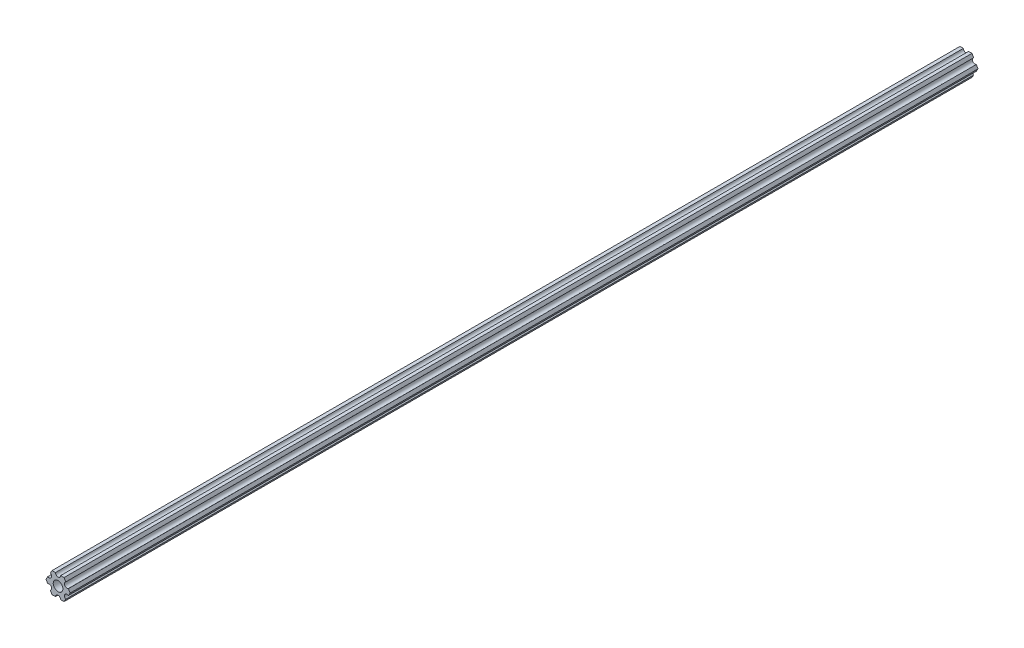
ISO-10303-21;
HEADER;
FILE_DESCRIPTION(('STEP AP214'),'2;1');
FILE_NAME('part.step','',(''),(''),'','','');
FILE_SCHEMA(('AUTOMOTIVE_DESIGN { 1 0 10303 214 1 1 1 1 }'));
ENDSEC;
DATA;
#1=APPLICATION_CONTEXT('core data for automotive mechanical design processes');
#2=APPLICATION_PROTOCOL_DEFINITION('international standard','automotive_design',2000,#1);
#3=PRODUCT_CONTEXT('',#1,'mechanical');
#4=PRODUCT('Part','Part','',(#3));
#5=PRODUCT_RELATED_PRODUCT_CATEGORY('part','',(#4));
#6=PRODUCT_DEFINITION_FORMATION('','',#4);
#7=PRODUCT_DEFINITION_CONTEXT('part definition',#1,'design');
#8=PRODUCT_DEFINITION('design','',#6,#7);
#9=PRODUCT_DEFINITION_SHAPE('','',#8);
#10=(LENGTH_UNIT() NAMED_UNIT(*) SI_UNIT(.MILLI.,.METRE.));
#11=(NAMED_UNIT(*) PLANE_ANGLE_UNIT() SI_UNIT($,.RADIAN.));
#12=(NAMED_UNIT(*) SI_UNIT($,.STERADIAN.) SOLID_ANGLE_UNIT());
#13=UNCERTAINTY_MEASURE_WITH_UNIT(LENGTH_MEASURE(1.E-05),#10,'distance_accuracy_value','');
#14=(GEOMETRIC_REPRESENTATION_CONTEXT(3) GLOBAL_UNCERTAINTY_ASSIGNED_CONTEXT((#13)) GLOBAL_UNIT_ASSIGNED_CONTEXT((#10,
#11,#12)) REPRESENTATION_CONTEXT('',''));
#15=CARTESIAN_POINT('',(0.,0.,0.));
#16=DIRECTION('',(0.,0.,1.));
#17=DIRECTION('',(1.,0.,0.));
#18=AXIS2_PLACEMENT_3D('',#15,#16,#17);
#19=CARTESIAN_POINT('',(5.49926150638083,-3.17499966684068,552.45));
#20=DIRECTION('',(0.,0.,-1.));
#21=DIRECTION('',(-1.,0.,0.));
#22=AXIS2_PLACEMENT_3D('',#19,#20,#21);
#23=CYLINDRICAL_SURFACE('',#22,1.58750000000001);
#24=CARTESIAN_POINT('',(5.49926150638083,-3.17499966684068,0.));
#25=DIRECTION('',(0.,0.,1.));
#26=DIRECTION('',(1.,0.,0.));
#27=AXIS2_PLACEMENT_3D('',#24,#25,#26);
#28=CIRCLE('',#27,1.58750000000001);
#29=CARTESIAN_POINT('',(6.29301142309098,-1.80018429024546,0.));
#30=VERTEX_POINT('',#29);
#31=CARTESIAN_POINT('',(4.70551158967068,-4.54981504343589,0.));
#32=VERTEX_POINT('',#31);
#33=EDGE_CURVE('E237',#30,#32,#28,.T.);
#34=ORIENTED_EDGE('',*,*,#33,.F.);
#35=DIRECTION('',(0.,0.,-1.));
#36=VECTOR('',#35,1.);
#37=CARTESIAN_POINT('',(6.29301142309098,-1.80018429024546,552.45));
#38=LINE('',#37,#36);
#39=CARTESIAN_POINT('',(6.29301142309098,-1.80018429024546,552.45));
#40=VERTEX_POINT('',#39);
#41=EDGE_CURVE('E11',#40,#30,#38,.T.);
#42=ORIENTED_EDGE('',*,*,#41,.F.);
#43=CARTESIAN_POINT('',(5.49926150638083,-3.17499966684068,552.45));
#44=DIRECTION('',(0.,0.,1.));
#45=DIRECTION('',(1.,0.,0.));
#46=AXIS2_PLACEMENT_3D('',#43,#44,#45);
#47=CIRCLE('',#46,1.58750000000001);
#48=CARTESIAN_POINT('',(4.70551158967068,-4.54981504343589,552.45));
#49=VERTEX_POINT('',#48);
#50=EDGE_CURVE('E306',#40,#49,#47,.T.);
#51=ORIENTED_EDGE('',*,*,#50,.T.);
#52=DIRECTION('',(0.,0.,-1.));
#53=VECTOR('',#52,1.);
#54=CARTESIAN_POINT('',(4.70551158967068,-4.54981504343589,552.45));
#55=LINE('',#54,#53);
#56=EDGE_CURVE('E41',#49,#32,#55,.T.);
#57=ORIENTED_EDGE('',*,*,#56,.T.);
#58=EDGE_LOOP('',(#34,#42,#51,#57));
#59=FACE_BOUND('',#58,.T.);
#60=ADVANCED_FACE('F38',(#59),#23,.F.);
#61=CARTESIAN_POINT('',(7.33234841870826,4.44212518856872E-07,552.45));
#62=DIRECTION('',(0.866025434075723,-0.499999947533953,0.));
#63=DIRECTION('',(0.499999947533953,0.866025434075723,0.));
#64=AXIS2_PLACEMENT_3D('',#61,#62,#63);
#65=PLANE('',#64);
#66=DIRECTION('',(-0.499999947533953,-0.866025434075723,0.));
#67=VECTOR('',#66,1.);
#68=CARTESIAN_POINT('',(7.33234841870826,4.44212518856872E-07,0.));
#69=LINE('',#68,#67);
#70=CARTESIAN_POINT('',(7.33234841870826,4.44212518856872E-07,0.));
#71=VERTEX_POINT('',#70);
#72=EDGE_CURVE('E303',#71,#30,#69,.T.);
#73=ORIENTED_EDGE('',*,*,#72,.F.);
#74=DIRECTION('',(0.,0.,-1.));
#75=VECTOR('',#74,1.);
#76=CARTESIAN_POINT('',(7.33234841870826,4.44212518856872E-07,552.45));
#77=LINE('',#76,#75);
#78=CARTESIAN_POINT('',(7.33234841870826,4.44212518856872E-07,552.45));
#79=VERTEX_POINT('',#78);
#80=EDGE_CURVE('E48',#79,#71,#77,.T.);
#81=ORIENTED_EDGE('',*,*,#80,.F.);
#82=DIRECTION('',(-0.499999947533953,-0.866025434075723,0.));
#83=VECTOR('',#82,1.);
#84=CARTESIAN_POINT('',(7.33234841870826,4.44212518856872E-07,552.45));
#85=LINE('',#84,#83);
#86=EDGE_CURVE('E223',#79,#40,#85,.T.);
#87=ORIENTED_EDGE('',*,*,#86,.T.);
#88=ORIENTED_EDGE('',*,*,#41,.T.);
#89=EDGE_LOOP('',(#73,#81,#87,#88));
#90=FACE_BOUND('',#89,.T.);
#91=ADVANCED_FACE('F354',(#90),#65,.T.);
#92=CARTESIAN_POINT('',(6.29301120497139,1.80018505273895,552.45));
#93=DIRECTION('',(0.866025373493145,0.500000052466056,0.));
#94=DIRECTION('',(-0.500000052466056,0.866025373493145,0.));
#95=AXIS2_PLACEMENT_3D('',#92,#93,#94);
#96=PLANE('',#95);
#97=DIRECTION('',(0.500000052466056,-0.866025373493145,0.));
#98=VECTOR('',#97,1.);
#99=CARTESIAN_POINT('',(6.29301120497139,1.80018505273895,0.));
#100=LINE('',#99,#98);
#101=CARTESIAN_POINT('',(6.29301120497139,1.80018505273895,0.));
#102=VERTEX_POINT('',#101);
#103=EDGE_CURVE('E209',#102,#71,#100,.T.);
#104=ORIENTED_EDGE('',*,*,#103,.F.);
#105=DIRECTION('',(0.,0.,-1.));
#106=VECTOR('',#105,1.);
#107=CARTESIAN_POINT('',(6.29301120497139,1.80018505273895,552.45));
#108=LINE('',#107,#106);
#109=CARTESIAN_POINT('',(6.29301120497139,1.80018505273895,552.45));
#110=VERTEX_POINT('',#109);
#111=EDGE_CURVE('E204',#110,#102,#108,.T.);
#112=ORIENTED_EDGE('',*,*,#111,.F.);
#113=DIRECTION('',(0.500000052466056,-0.866025373493145,0.));
#114=VECTOR('',#113,1.);
#115=CARTESIAN_POINT('',(6.29301120497139,1.80018505273895,552.45));
#116=LINE('',#115,#114);
#117=EDGE_CURVE('E207',#110,#79,#116,.T.);
#118=ORIENTED_EDGE('',*,*,#117,.T.);
#119=ORIENTED_EDGE('',*,*,#80,.T.);
#120=EDGE_LOOP('',(#104,#112,#118,#119));
#121=FACE_BOUND('',#120,.T.);
#122=ADVANCED_FACE('F206',(#121),#96,.T.);
#123=CARTESIAN_POINT('',(5.49926112168152,3.17500033315931,552.45));
#124=DIRECTION('',(0.,0.,-1.));
#125=DIRECTION('',(-1.,0.,0.));
#126=AXIS2_PLACEMENT_3D('',#123,#124,#125);
#127=CYLINDRICAL_SURFACE('',#126,1.5875);
#128=CARTESIAN_POINT('',(5.49926112168152,3.17500033315931,0.));
#129=DIRECTION('',(0.,0.,1.));
#130=DIRECTION('',(1.,0.,0.));
#131=AXIS2_PLACEMENT_3D('',#128,#129,#130);
#132=CIRCLE('',#131,1.5875);
#133=CARTESIAN_POINT('',(4.70551103839166,4.54981561357968,0.));
#134=VERTEX_POINT('',#133);
#135=EDGE_CURVE('E298',#134,#102,#132,.T.);
#136=ORIENTED_EDGE('',*,*,#135,.F.);
#137=DIRECTION('',(0.,0.,-1.));
#138=VECTOR('',#137,1.);
#139=CARTESIAN_POINT('',(4.70551103839166,4.54981561357968,552.45));
#140=LINE('',#139,#138);
#141=CARTESIAN_POINT('',(4.70551103839166,4.54981561357968,552.45));
#142=VERTEX_POINT('',#141);
#143=EDGE_CURVE('E215',#142,#134,#140,.T.);
#144=ORIENTED_EDGE('',*,*,#143,.F.);
#145=CARTESIAN_POINT('',(5.49926112168152,3.17500033315931,552.45));
#146=DIRECTION('',(0.,0.,1.));
#147=DIRECTION('',(1.,0.,0.));
#148=AXIS2_PLACEMENT_3D('',#145,#146,#147);
#149=CIRCLE('',#148,1.5875);
#150=EDGE_CURVE('E221',#142,#110,#149,.T.);
#151=ORIENTED_EDGE('',*,*,#150,.T.);
#152=ORIENTED_EDGE('',*,*,#111,.T.);
#153=EDGE_LOOP('',(#136,#144,#151,#152));
#154=FACE_BOUND('',#153,.T.);
#155=ADVANCED_FACE('F226',(#154),#127,.F.);
#156=CARTESIAN_POINT('',(3.66617382465472,6.35000022210622,552.45));
#157=DIRECTION('',(0.866025373493145,0.500000052466056,0.));
#158=DIRECTION('',(-0.500000052466056,0.866025373493145,0.));
#159=AXIS2_PLACEMENT_3D('',#156,#157,#158);
#160=PLANE('',#159);
#161=DIRECTION('',(0.500000052466056,-0.866025373493145,0.));
#162=VECTOR('',#161,1.);
#163=CARTESIAN_POINT('',(3.66617382465472,6.35000022210622,0.));
#164=LINE('',#163,#162);
#165=CARTESIAN_POINT('',(3.66617382465472,6.35000022210622,0.));
#166=VERTEX_POINT('',#165);
#167=EDGE_CURVE('E294',#166,#134,#164,.T.);
#168=ORIENTED_EDGE('',*,*,#167,.F.);
#169=DIRECTION('',(0.,0.,-1.));
#170=VECTOR('',#169,1.);
#171=CARTESIAN_POINT('',(3.66617382465472,6.35000022210622,552.45));
#172=LINE('',#171,#170);
#173=CARTESIAN_POINT('',(3.66617382465472,6.35000022210622,552.45));
#174=VERTEX_POINT('',#173);
#175=EDGE_CURVE('E312',#174,#166,#172,.T.);
#176=ORIENTED_EDGE('',*,*,#175,.F.);
#177=DIRECTION('',(0.500000052466056,-0.866025373493145,0.));
#178=VECTOR('',#177,1.);
#179=CARTESIAN_POINT('',(3.66617382465472,6.35000022210622,552.45));
#180=LINE('',#179,#178);
#181=EDGE_CURVE('E228',#174,#142,#180,.T.);
#182=ORIENTED_EDGE('',*,*,#181,.T.);
#183=ORIENTED_EDGE('',*,*,#143,.T.);
#184=EDGE_LOOP('',(#168,#176,#182,#183));
#185=FACE_BOUND('',#184,.T.);
#186=ADVANCED_FACE('F367',(#185),#160,.T.);
#187=CARTESIAN_POINT('',(1.58749961530066,6.35000022210623,552.45));
#188=DIRECTION('',(0.,1.,0.));
#189=DIRECTION('',(-1.,0.,0.));
#190=AXIS2_PLACEMENT_3D('',#187,#188,#189);
#191=PLANE('',#190);
#192=DIRECTION('',(1.,0.,0.));
#193=VECTOR('',#192,1.);
#194=CARTESIAN_POINT('',(1.58749961530066,6.35000022210623,0.));
#195=LINE('',#194,#193);
#196=CARTESIAN_POINT('',(1.58749961530066,6.35000022210623,0.));
#197=VERTEX_POINT('',#196);
#198=EDGE_CURVE('E290',#197,#166,#195,.T.);
#199=ORIENTED_EDGE('',*,*,#198,.F.);
#200=DIRECTION('',(0.,0.,-1.));
#201=VECTOR('',#200,1.);
#202=CARTESIAN_POINT('',(1.58749961530066,6.35000022210623,552.45));
#203=LINE('',#202,#201);
#204=CARTESIAN_POINT('',(1.58749961530066,6.35000022210623,552.45));
#205=VERTEX_POINT('',#204);
#206=EDGE_CURVE('E315',#205,#197,#203,.T.);
#207=ORIENTED_EDGE('',*,*,#206,.F.);
#208=DIRECTION('',(1.,0.,0.));
#209=VECTOR('',#208,1.);
#210=CARTESIAN_POINT('',(1.58749961530066,6.35000022210623,552.45));
#211=LINE('',#210,#209);
#212=EDGE_CURVE('E232',#205,#174,#211,.T.);
#213=ORIENTED_EDGE('',*,*,#212,.T.);
#214=ORIENTED_EDGE('',*,*,#175,.T.);
#215=EDGE_LOOP('',(#199,#207,#213,#214));
#216=FACE_BOUND('',#215,.T.);
#217=ADVANCED_FACE('F370',(#216),#191,.T.);
#218=CARTESIAN_POINT('',(-3.84699344941095E-07,6.35000022210623,552.45));
#219=DIRECTION('',(0.,0.,-1.));
#220=DIRECTION('',(-1.,0.,0.));
#221=AXIS2_PLACEMENT_3D('',#218,#219,#220);
#222=CYLINDRICAL_SURFACE('',#221,1.5875);
#223=CARTESIAN_POINT('',(-3.84699344941095E-07,6.35000022210623,0.));
#224=DIRECTION('',(0.,0.,1.));
#225=DIRECTION('',(1.,0.,0.));
#226=AXIS2_PLACEMENT_3D('',#223,#224,#225);
#227=CIRCLE('',#226,1.5875);
#228=CARTESIAN_POINT('',(-1.58750038469935,6.35000022210623,0.));
#229=VERTEX_POINT('',#228);
#230=EDGE_CURVE('E286',#229,#197,#227,.T.);
#231=ORIENTED_EDGE('',*,*,#230,.F.);
#232=DIRECTION('',(0.,0.,-1.));
#233=VECTOR('',#232,1.);
#234=CARTESIAN_POINT('',(-1.58750038469935,6.35000022210623,552.45));
#235=LINE('',#234,#233);
#236=CARTESIAN_POINT('',(-1.58750038469935,6.35000022210623,552.45));
#237=VERTEX_POINT('',#236);
#238=EDGE_CURVE('E318',#237,#229,#235,.T.);
#239=ORIENTED_EDGE('',*,*,#238,.F.);
#240=CARTESIAN_POINT('',(-3.84699344941095E-07,6.35000022210623,552.45));
#241=DIRECTION('',(0.,0.,1.));
#242=DIRECTION('',(1.,0.,0.));
#243=AXIS2_PLACEMENT_3D('',#240,#241,#242);
#244=CIRCLE('',#243,1.5875);
#245=EDGE_CURVE('E489',#237,#205,#244,.T.);
#246=ORIENTED_EDGE('',*,*,#245,.T.);
#247=ORIENTED_EDGE('',*,*,#206,.T.);
#248=EDGE_LOOP('',(#231,#239,#246,#247));
#249=FACE_BOUND('',#248,.T.);
#250=ADVANCED_FACE('F374',(#249),#222,.F.);
#251=CARTESIAN_POINT('',(-3.66617452134701,6.35000022210623,552.45));
#252=DIRECTION('',(0.,1.,0.));
#253=DIRECTION('',(0.,0.,1.));
#254=AXIS2_PLACEMENT_3D('',#251,#252,#253);
#255=PLANE('',#254);
#256=DIRECTION('',(1.,0.,0.));
#257=VECTOR('',#256,1.);
#258=CARTESIAN_POINT('',(-3.66617452134701,6.35000022210623,0.));
#259=LINE('',#258,#257);
#260=CARTESIAN_POINT('',(-3.66617452134701,6.35000022210623,0.));
#261=VERTEX_POINT('',#260);
#262=EDGE_CURVE('E282',#261,#229,#259,.T.);
#263=ORIENTED_EDGE('',*,*,#262,.F.);
#264=DIRECTION('',(0.,0.,-1.));
#265=VECTOR('',#264,1.);
#266=CARTESIAN_POINT('',(-3.66617452134701,6.35000022210623,552.45));
#267=LINE('',#266,#265);
#268=CARTESIAN_POINT('',(-3.66617452134701,6.35000022210623,552.45));
#269=VERTEX_POINT('',#268);
#270=EDGE_CURVE('E321',#269,#261,#267,.T.);
#271=ORIENTED_EDGE('',*,*,#270,.F.);
#272=DIRECTION('',(1.,0.,0.));
#273=VECTOR('',#272,1.);
#274=CARTESIAN_POINT('',(-3.66617452134701,6.35000022210623,552.45));
#275=LINE('',#274,#273);
#276=EDGE_CURVE('E485',#269,#237,#275,.T.);
#277=ORIENTED_EDGE('',*,*,#276,.T.);
#278=ORIENTED_EDGE('',*,*,#238,.T.);
#279=EDGE_LOOP('',(#263,#271,#277,#278));
#280=FACE_BOUND('',#279,.T.);
#281=ADVANCED_FACE('F378',(#280),#255,.T.);
#282=CARTESIAN_POINT('',(-4.70551145677116,4.54981548085265,552.45));
#283=DIRECTION('',(-0.866025447431971,0.499999924400249,0.));
#284=DIRECTION('',(-0.499999924400249,-0.866025447431971,0.));
#285=AXIS2_PLACEMENT_3D('',#282,#283,#284);
#286=PLANE('',#285);
#287=DIRECTION('',(0.499999924400249,0.866025447431971,0.));
#288=VECTOR('',#287,1.);
#289=CARTESIAN_POINT('',(-4.70551145677116,4.54981548085265,0.));
#290=LINE('',#289,#288);
#291=CARTESIAN_POINT('',(-4.70551145677116,4.54981548085265,0.));
#292=VERTEX_POINT('',#291);
#293=EDGE_CURVE('E278',#292,#261,#290,.T.);
#294=ORIENTED_EDGE('',*,*,#293,.F.);
#295=DIRECTION('',(0.,0.,-1.));
#296=VECTOR('',#295,1.);
#297=CARTESIAN_POINT('',(-4.70551145677116,4.54981548085265,552.45));
#298=LINE('',#297,#296);
#299=CARTESIAN_POINT('',(-4.70551145677116,4.54981548085265,552.45));
#300=VERTEX_POINT('',#299);
#301=EDGE_CURVE('E324',#300,#292,#298,.T.);
#302=ORIENTED_EDGE('',*,*,#301,.F.);
#303=DIRECTION('',(0.499999924400249,0.866025447431971,0.));
#304=VECTOR('',#303,1.);
#305=CARTESIAN_POINT('',(-4.70551145677116,4.54981548085265,552.45));
#306=LINE('',#305,#304);
#307=EDGE_CURVE('E481',#300,#269,#306,.T.);
#308=ORIENTED_EDGE('',*,*,#307,.T.);
#309=ORIENTED_EDGE('',*,*,#270,.T.);
#310=EDGE_LOOP('',(#294,#302,#308,#309));
#311=FACE_BOUND('',#310,.T.);
#312=ADVANCED_FACE('F382',(#311),#286,.T.);
#313=CARTESIAN_POINT('',(-5.49926133675655,3.17500008305439,552.45));
#314=DIRECTION('',(0.,0.,-1.));
#315=DIRECTION('',(-1.,0.,0.));
#316=AXIS2_PLACEMENT_3D('',#313,#314,#315);
#317=CYLINDRICAL_SURFACE('',#316,1.5875);
#318=CARTESIAN_POINT('',(-5.49926133675655,3.17500008305439,0.));
#319=DIRECTION('',(0.,0.,1.));
#320=DIRECTION('',(1.,0.,0.));
#321=AXIS2_PLACEMENT_3D('',#318,#319,#320);
#322=CIRCLE('',#321,1.5875);
#323=CARTESIAN_POINT('',(-6.29301121674195,1.80018468525613,0.));
#324=VERTEX_POINT('',#323);
#325=EDGE_CURVE('E274',#324,#292,#322,.T.);
#326=ORIENTED_EDGE('',*,*,#325,.F.);
#327=DIRECTION('',(0.,0.,-1.));
#328=VECTOR('',#327,1.);
#329=CARTESIAN_POINT('',(-6.29301121674195,1.80018468525613,552.45));
#330=LINE('',#329,#328);
#331=CARTESIAN_POINT('',(-6.29301121674195,1.80018468525613,552.45));
#332=VERTEX_POINT('',#331);
#333=EDGE_CURVE('E327',#332,#324,#330,.T.);
#334=ORIENTED_EDGE('',*,*,#333,.F.);
#335=CARTESIAN_POINT('',(-5.49926133675655,3.17500008305439,552.45));
#336=DIRECTION('',(0.,0.,1.));
#337=DIRECTION('',(1.,0.,0.));
#338=AXIS2_PLACEMENT_3D('',#335,#336,#337);
#339=CIRCLE('',#338,1.5875);
#340=EDGE_CURVE('E477',#332,#300,#339,.T.);
#341=ORIENTED_EDGE('',*,*,#340,.T.);
#342=ORIENTED_EDGE('',*,*,#301,.T.);
#343=EDGE_LOOP('',(#326,#334,#341,#342));
#344=FACE_BOUND('',#343,.T.);
#345=ADVANCED_FACE('F386',(#344),#317,.F.);
#346=CARTESIAN_POINT('',(-7.33234807945963,6.99338729030344E-08,552.45));
#347=DIRECTION('',(-0.866025447431971,0.499999924400249,0.));
#348=DIRECTION('',(-0.499999924400249,-0.866025447431971,0.));
#349=AXIS2_PLACEMENT_3D('',#346,#347,#348);
#350=PLANE('',#349);
#351=DIRECTION('',(0.499999924400249,0.866025447431971,0.));
#352=VECTOR('',#351,1.);
#353=CARTESIAN_POINT('',(-7.33234807945963,6.99338729030344E-08,0.));
#354=LINE('',#353,#352);
#355=CARTESIAN_POINT('',(-7.33234807945963,6.99338729030344E-08,0.));
#356=VERTEX_POINT('',#355);
#357=EDGE_CURVE('E270',#356,#324,#354,.T.);
#358=ORIENTED_EDGE('',*,*,#357,.F.);
#359=DIRECTION('',(0.,0.,-1.));
#360=VECTOR('',#359,1.);
#361=CARTESIAN_POINT('',(-7.33234807945963,6.99338729030344E-08,552.45));
#362=LINE('',#361,#360);
#363=CARTESIAN_POINT('',(-7.33234807945963,6.99338729030344E-08,552.45));
#364=VERTEX_POINT('',#363);
#365=EDGE_CURVE('E330',#364,#356,#362,.T.);
#366=ORIENTED_EDGE('',*,*,#365,.F.);
#367=DIRECTION('',(0.499999924400249,0.866025447431971,0.));
#368=VECTOR('',#367,1.);
#369=CARTESIAN_POINT('',(-7.33234807945963,6.99338729030344E-08,552.45));
#370=LINE('',#369,#368);
#371=EDGE_CURVE('E473',#364,#332,#370,.T.);
#372=ORIENTED_EDGE('',*,*,#371,.T.);
#373=ORIENTED_EDGE('',*,*,#333,.T.);
#374=EDGE_LOOP('',(#358,#366,#372,#373));
#375=FACE_BOUND('',#374,.T.);
#376=ADVANCED_FACE('F390',(#375),#350,.T.);
#377=CARTESIAN_POINT('',(-6.29301096189761,-1.80018459411914,552.45));
#378=DIRECTION('',(-0.866025400205645,-0.500000006198653,0.));
#379=DIRECTION('',(0.500000006198653,-0.866025400205645,0.));
#380=AXIS2_PLACEMENT_3D('',#377,#378,#379);
#381=PLANE('',#380);
#382=DIRECTION('',(-0.500000006198653,0.866025400205645,0.));
#383=VECTOR('',#382,1.);
#384=CARTESIAN_POINT('',(-6.29301096189761,-1.80018459411914,0.));
#385=LINE('',#384,#383);
#386=CARTESIAN_POINT('',(-6.29301096189761,-1.80018459411914,0.));
#387=VERTEX_POINT('',#386);
#388=EDGE_CURVE('E266',#387,#356,#385,.T.);
#389=ORIENTED_EDGE('',*,*,#388,.F.);
#390=DIRECTION('',(0.,0.,-1.));
#391=VECTOR('',#390,1.);
#392=CARTESIAN_POINT('',(-6.29301096189761,-1.80018459411914,552.45));
#393=LINE('',#392,#391);
#394=CARTESIAN_POINT('',(-6.29301096189761,-1.80018459411914,552.45));
#395=VERTEX_POINT('',#394);
#396=EDGE_CURVE('E333',#395,#387,#393,.T.);
#397=ORIENTED_EDGE('',*,*,#396,.F.);
#398=DIRECTION('',(-0.500000006198653,0.866025400205645,0.));
#399=VECTOR('',#398,1.);
#400=CARTESIAN_POINT('',(-6.29301096189761,-1.80018459411914,552.45));
#401=LINE('',#400,#399);
#402=EDGE_CURVE('E469',#395,#364,#401,.T.);
#403=ORIENTED_EDGE('',*,*,#402,.T.);
#404=ORIENTED_EDGE('',*,*,#365,.T.);
#405=EDGE_LOOP('',(#389,#397,#403,#404));
#406=FACE_BOUND('',#405,.T.);
#407=ADVANCED_FACE('F394',(#406),#381,.T.);
#408=CARTESIAN_POINT('',(-5.49926095205725,-3.1749999169456,552.45));
#409=DIRECTION('',(0.,0.,-1.));
#410=DIRECTION('',(-1.,0.,0.));
#411=AXIS2_PLACEMENT_3D('',#408,#409,#410);
#412=CYLINDRICAL_SURFACE('',#411,1.5875);
#413=CARTESIAN_POINT('',(-5.49926095205725,-3.1749999169456,0.));
#414=DIRECTION('',(0.,0.,1.));
#415=DIRECTION('',(1.,0.,0.));
#416=AXIS2_PLACEMENT_3D('',#413,#414,#415);
#417=CIRCLE('',#416,1.5875);
#418=CARTESIAN_POINT('',(-4.70551094221689,-4.54981523977206,0.));
#419=VERTEX_POINT('',#418);
#420=EDGE_CURVE('E262',#419,#387,#417,.T.);
#421=ORIENTED_EDGE('',*,*,#420,.F.);
#422=DIRECTION('',(0.,0.,-1.));
#423=VECTOR('',#422,1.);
#424=CARTESIAN_POINT('',(-4.70551094221689,-4.54981523977206,552.45));
#425=LINE('',#424,#423);
#426=CARTESIAN_POINT('',(-4.70551094221689,-4.54981523977206,552.45));
#427=VERTEX_POINT('',#426);
#428=EDGE_CURVE('E336',#427,#419,#425,.T.);
#429=ORIENTED_EDGE('',*,*,#428,.F.);
#430=CARTESIAN_POINT('',(-5.49926095205725,-3.1749999169456,552.45));
#431=DIRECTION('',(0.,0.,1.));
#432=DIRECTION('',(1.,0.,0.));
#433=AXIS2_PLACEMENT_3D('',#430,#431,#432);
#434=CIRCLE('',#433,1.5875);
#435=EDGE_CURVE('E465',#427,#395,#434,.T.);
#436=ORIENTED_EDGE('',*,*,#435,.T.);
#437=ORIENTED_EDGE('',*,*,#396,.T.);
#438=EDGE_LOOP('',(#421,#429,#436,#437));
#439=FACE_BOUND('',#438,.T.);
#440=ADVANCED_FACE('F398',(#439),#412,.F.);
#441=CARTESIAN_POINT('',(-3.66617382465481,-6.34999990382519,552.45));
#442=DIRECTION('',(-0.866025400205645,-0.500000006198653,0.));
#443=DIRECTION('',(0.500000006198653,-0.866025400205645,0.));
#444=AXIS2_PLACEMENT_3D('',#441,#442,#443);
#445=PLANE('',#444);
#446=DIRECTION('',(-0.500000006198653,0.866025400205644,0.));
#447=VECTOR('',#446,1.);
#448=CARTESIAN_POINT('',(-3.66617382465481,-6.34999990382519,0.));
#449=LINE('',#448,#447);
#450=CARTESIAN_POINT('',(-3.66617382465481,-6.34999990382519,0.));
#451=VERTEX_POINT('',#450);
#452=EDGE_CURVE('E258',#451,#419,#449,.T.);
#453=ORIENTED_EDGE('',*,*,#452,.F.);
#454=DIRECTION('',(0.,0.,-1.));
#455=VECTOR('',#454,1.);
#456=CARTESIAN_POINT('',(-3.66617382465481,-6.34999990382519,552.45));
#457=LINE('',#456,#455);
#458=CARTESIAN_POINT('',(-3.66617382465481,-6.34999990382519,552.45));
#459=VERTEX_POINT('',#458);
#460=EDGE_CURVE('E339',#459,#451,#457,.T.);
#461=ORIENTED_EDGE('',*,*,#460,.F.);
#462=DIRECTION('',(-0.500000006198653,0.866025400205644,0.));
#463=VECTOR('',#462,1.);
#464=CARTESIAN_POINT('',(-3.66617382465481,-6.34999990382519,552.45));
#465=LINE('',#464,#463);
#466=EDGE_CURVE('E461',#459,#427,#465,.T.);
#467=ORIENTED_EDGE('',*,*,#466,.T.);
#468=ORIENTED_EDGE('',*,*,#428,.T.);
#469=EDGE_LOOP('',(#453,#461,#467,#468));
#470=FACE_BOUND('',#469,.T.);
#471=ADVANCED_FACE('F402',(#470),#445,.T.);
#472=CARTESIAN_POINT('',(-1.58749961530074,-6.34999990382519,552.45));
#473=DIRECTION('',(0.,-1.,0.));
#474=DIRECTION('',(1.,0.,0.));
#475=AXIS2_PLACEMENT_3D('',#472,#473,#474);
#476=PLANE('',#475);
#477=DIRECTION('',(-1.,0.,0.));
#478=VECTOR('',#477,1.);
#479=CARTESIAN_POINT('',(-1.58749961530074,-6.34999990382519,0.));
#480=LINE('',#479,#478);
#481=CARTESIAN_POINT('',(-1.58749961530074,-6.34999990382519,0.));
#482=VERTEX_POINT('',#481);
#483=EDGE_CURVE('E254',#482,#451,#480,.T.);
#484=ORIENTED_EDGE('',*,*,#483,.F.);
#485=DIRECTION('',(0.,0.,-1.));
#486=VECTOR('',#485,1.);
#487=CARTESIAN_POINT('',(-1.58749961530074,-6.34999990382519,552.45));
#488=LINE('',#487,#486);
#489=CARTESIAN_POINT('',(-1.58749961530074,-6.34999990382519,552.45));
#490=VERTEX_POINT('',#489);
#491=EDGE_CURVE('E342',#490,#482,#488,.T.);
#492=ORIENTED_EDGE('',*,*,#491,.F.);
#493=DIRECTION('',(-1.,0.,0.));
#494=VECTOR('',#493,1.);
#495=CARTESIAN_POINT('',(-1.58749961530074,-6.34999990382519,552.45));
#496=LINE('',#495,#494);
#497=EDGE_CURVE('E457',#490,#459,#496,.T.);
#498=ORIENTED_EDGE('',*,*,#497,.T.);
#499=ORIENTED_EDGE('',*,*,#460,.T.);
#500=EDGE_LOOP('',(#484,#492,#498,#499));
#501=FACE_BOUND('',#500,.T.);
#502=ADVANCED_FACE('F406',(#501),#476,.T.);
#503=CARTESIAN_POINT('',(3.8469926204343E-07,-6.34999990382519,552.45));
#504=DIRECTION('',(0.,0.,-1.));
#505=DIRECTION('',(-1.,0.,0.));
#506=AXIS2_PLACEMENT_3D('',#503,#504,#505);
#507=CYLINDRICAL_SURFACE('',#506,1.5875);
#508=CARTESIAN_POINT('',(3.8469926204343E-07,-6.34999990382519,0.));
#509=DIRECTION('',(0.,0.,1.));
#510=DIRECTION('',(1.,0.,0.));
#511=AXIS2_PLACEMENT_3D('',#508,#509,#510);
#512=CIRCLE('',#511,1.5875);
#513=CARTESIAN_POINT('',(1.58750038469926,-6.34999990382518,0.));
#514=VERTEX_POINT('',#513);
#515=EDGE_CURVE('E250',#514,#482,#512,.T.);
#516=ORIENTED_EDGE('',*,*,#515,.F.);
#517=DIRECTION('',(0.,0.,-1.));
#518=VECTOR('',#517,1.);
#519=CARTESIAN_POINT('',(1.58750038469926,-6.34999990382518,552.45));
#520=LINE('',#519,#518);
#521=CARTESIAN_POINT('',(1.58750038469926,-6.34999990382518,552.45));
#522=VERTEX_POINT('',#521);
#523=EDGE_CURVE('E345',#522,#514,#520,.T.);
#524=ORIENTED_EDGE('',*,*,#523,.F.);
#525=CARTESIAN_POINT('',(3.8469926204343E-07,-6.34999990382519,552.45));
#526=DIRECTION('',(0.,0.,1.));
#527=DIRECTION('',(1.,0.,0.));
#528=AXIS2_PLACEMENT_3D('',#525,#526,#527);
#529=CIRCLE('',#528,1.5875);
#530=EDGE_CURVE('E453',#522,#490,#529,.T.);
#531=ORIENTED_EDGE('',*,*,#530,.T.);
#532=ORIENTED_EDGE('',*,*,#491,.T.);
#533=EDGE_LOOP('',(#516,#524,#531,#532));
#534=FACE_BOUND('',#533,.T.);
#535=ADVANCED_FACE('F410',(#534),#507,.F.);
#536=CARTESIAN_POINT('',(3.66617452134693,-6.34999990382519,552.45));
#537=DIRECTION('',(0.,-1.,0.));
#538=DIRECTION('',(1.,0.,0.));
#539=AXIS2_PLACEMENT_3D('',#536,#537,#538);
#540=PLANE('',#539);
#541=DIRECTION('',(-1.,0.,0.));
#542=VECTOR('',#541,1.);
#543=CARTESIAN_POINT('',(3.66617452134693,-6.34999990382519,0.));
#544=LINE('',#543,#542);
#545=CARTESIAN_POINT('',(3.66617452134693,-6.34999990382519,0.));
#546=VERTEX_POINT('',#545);
#547=EDGE_CURVE('E246',#546,#514,#544,.T.);
#548=ORIENTED_EDGE('',*,*,#547,.F.);
#549=DIRECTION('',(0.,0.,-1.));
#550=VECTOR('',#549,1.);
#551=CARTESIAN_POINT('',(3.66617452134693,-6.34999990382519,552.45));
#552=LINE('',#551,#550);
#553=CARTESIAN_POINT('',(3.66617452134693,-6.34999990382519,552.45));
#554=VERTEX_POINT('',#553);
#555=EDGE_CURVE('E347',#554,#546,#552,.T.);
#556=ORIENTED_EDGE('',*,*,#555,.F.);
#557=DIRECTION('',(-1.,0.,0.));
#558=VECTOR('',#557,1.);
#559=CARTESIAN_POINT('',(3.66617452134693,-6.34999990382519,552.45));
#560=LINE('',#559,#558);
#561=EDGE_CURVE('E449',#554,#522,#560,.T.);
#562=ORIENTED_EDGE('',*,*,#561,.T.);
#563=ORIENTED_EDGE('',*,*,#523,.T.);
#564=EDGE_LOOP('',(#548,#556,#562,#563));
#565=FACE_BOUND('',#564,.T.);
#566=ADVANCED_FACE('F414',(#565),#540,.T.);
#567=CARTESIAN_POINT('',(4.70551158967068,-4.54981504343589,552.45));
#568=DIRECTION('',(0.866025434075723,-0.499999947533953,0.));
#569=DIRECTION('',(0.499999947533953,0.866025434075723,0.));
#570=AXIS2_PLACEMENT_3D('',#567,#568,#569);
#571=PLANE('',#570);
#572=DIRECTION('',(-0.499999947533953,-0.866025434075723,0.));
#573=VECTOR('',#572,1.);
#574=CARTESIAN_POINT('',(4.70551158967068,-4.54981504343589,0.));
#575=LINE('',#574,#573);
#576=EDGE_CURVE('E241',#32,#546,#575,.T.);
#577=ORIENTED_EDGE('',*,*,#576,.F.);
#578=ORIENTED_EDGE('',*,*,#56,.F.);
#579=DIRECTION('',(-0.499999947533953,-0.866025434075723,0.));
#580=VECTOR('',#579,1.);
#581=CARTESIAN_POINT('',(4.70551158967068,-4.54981504343589,552.45));
#582=LINE('',#581,#580);
#583=EDGE_CURVE('E446',#49,#554,#582,.T.);
#584=ORIENTED_EDGE('',*,*,#583,.T.);
#585=ORIENTED_EDGE('',*,*,#555,.T.);
#586=EDGE_LOOP('',(#577,#578,#584,#585));
#587=FACE_BOUND('',#586,.T.);
#588=ADVANCED_FACE('F351',(#587),#571,.T.);
#589=CARTESIAN_POINT('',(5.49926150638083,-3.17499966684068,552.45));
#590=DIRECTION('',(0.,0.,1.));
#591=DIRECTION('',(1.,0.,0.));
#592=AXIS2_PLACEMENT_3D('',#589,#590,#591);
#593=PLANE('',#592);
#594=CARTESIAN_POINT('',(0.,0.,552.45));
#595=DIRECTION('',(0.,0.,-1.));
#596=DIRECTION('',(1.,0.,0.));
#597=AXIS2_PLACEMENT_3D('',#594,#595,#596);
#598=CIRCLE('',#597,2.9337);
#599=CARTESIAN_POINT('',(2.9337,0.,552.45));
#600=VERTEX_POINT('',#599);
#601=EDGE_CURVE('E242',#600,#600,#598,.T.);
#602=ORIENTED_EDGE('',*,*,#601,.T.);
#603=EDGE_LOOP('',(#602));
#604=FACE_BOUND('',#603,.T.);
#605=ORIENTED_EDGE('',*,*,#50,.F.);
#606=ORIENTED_EDGE('',*,*,#86,.F.);
#607=ORIENTED_EDGE('',*,*,#117,.F.);
#608=ORIENTED_EDGE('',*,*,#150,.F.);
#609=ORIENTED_EDGE('',*,*,#181,.F.);
#610=ORIENTED_EDGE('',*,*,#212,.F.);
#611=ORIENTED_EDGE('',*,*,#245,.F.);
#612=ORIENTED_EDGE('',*,*,#276,.F.);
#613=ORIENTED_EDGE('',*,*,#307,.F.);
#614=ORIENTED_EDGE('',*,*,#340,.F.);
#615=ORIENTED_EDGE('',*,*,#371,.F.);
#616=ORIENTED_EDGE('',*,*,#402,.F.);
#617=ORIENTED_EDGE('',*,*,#435,.F.);
#618=ORIENTED_EDGE('',*,*,#466,.F.);
#619=ORIENTED_EDGE('',*,*,#497,.F.);
#620=ORIENTED_EDGE('',*,*,#530,.F.);
#621=ORIENTED_EDGE('',*,*,#561,.F.);
#622=ORIENTED_EDGE('',*,*,#583,.F.);
#623=EDGE_LOOP('',(#605,#606,#607,#608,#609,#610,#611,#612,#613,#614,#615,#616,#617,#618,#619,
#620,#621,#622));
#624=FACE_BOUND('',#623,.T.);
#625=ADVANCED_FACE('F219',(#604,#624),#593,.T.);
#626=CARTESIAN_POINT('',(5.49926150638083,-3.17499966684068,0.));
#627=DIRECTION('',(0.,0.,1.));
#628=DIRECTION('',(1.,0.,0.));
#629=AXIS2_PLACEMENT_3D('',#626,#627,#628);
#630=PLANE('',#629);
#631=CARTESIAN_POINT('',(0.,0.,0.));
#632=DIRECTION('',(0.,0.,-1.));
#633=DIRECTION('',(1.,0.,0.));
#634=AXIS2_PLACEMENT_3D('',#631,#632,#633);
#635=CIRCLE('',#634,2.9337);
#636=CARTESIAN_POINT('',(2.9337,0.,0.));
#637=VERTEX_POINT('',#636);
#638=EDGE_CURVE('E438',#637,#637,#635,.T.);
#639=ORIENTED_EDGE('',*,*,#638,.F.);
#640=EDGE_LOOP('',(#639));
#641=FACE_BOUND('',#640,.T.);
#642=ORIENTED_EDGE('',*,*,#33,.T.);
#643=ORIENTED_EDGE('',*,*,#576,.T.);
#644=ORIENTED_EDGE('',*,*,#547,.T.);
#645=ORIENTED_EDGE('',*,*,#515,.T.);
#646=ORIENTED_EDGE('',*,*,#483,.T.);
#647=ORIENTED_EDGE('',*,*,#452,.T.);
#648=ORIENTED_EDGE('',*,*,#420,.T.);
#649=ORIENTED_EDGE('',*,*,#388,.T.);
#650=ORIENTED_EDGE('',*,*,#357,.T.);
#651=ORIENTED_EDGE('',*,*,#325,.T.);
#652=ORIENTED_EDGE('',*,*,#293,.T.);
#653=ORIENTED_EDGE('',*,*,#262,.T.);
#654=ORIENTED_EDGE('',*,*,#230,.T.);
#655=ORIENTED_EDGE('',*,*,#198,.T.);
#656=ORIENTED_EDGE('',*,*,#167,.T.);
#657=ORIENTED_EDGE('',*,*,#135,.T.);
#658=ORIENTED_EDGE('',*,*,#103,.T.);
#659=ORIENTED_EDGE('',*,*,#72,.T.);
#660=EDGE_LOOP('',(#642,#643,#644,#645,#646,#647,#648,#649,#650,#651,#652,#653,#654,#655,#656,
#657,#658,#659));
#661=FACE_BOUND('',#660,.T.);
#662=ADVANCED_FACE('F353',(#641,#661),#630,.F.);
#663=CARTESIAN_POINT('',(0.,0.,552.45));
#664=DIRECTION('',(0.,0.,-1.));
#665=DIRECTION('',(-1.,0.,0.));
#666=AXIS2_PLACEMENT_3D('',#663,#664,#665);
#667=CYLINDRICAL_SURFACE('',#666,2.9337);
#668=ORIENTED_EDGE('',*,*,#601,.F.);
#669=EDGE_LOOP('',(#668));
#670=FACE_BOUND('',#669,.T.);
#671=ORIENTED_EDGE('',*,*,#638,.T.);
#672=EDGE_LOOP('',(#671));
#673=FACE_BOUND('',#672,.T.);
#674=ADVANCED_FACE('F426',(#670,#673),#667,.F.);
#675=CLOSED_SHELL('',(#60,#91,#122,#155,#186,#217,#250,#281,#312,#345,#376,#407,#440,#471,#502,
#535,#566,#588,#625,#662,#674));
#676=MANIFOLD_SOLID_BREP('B2',#675);
#677=ADVANCED_BREP_SHAPE_REPRESENTATION('',(#18,#676),#14);
#678=SHAPE_DEFINITION_REPRESENTATION(#9,#677);
ENDSEC;
END-ISO-10303-21;
